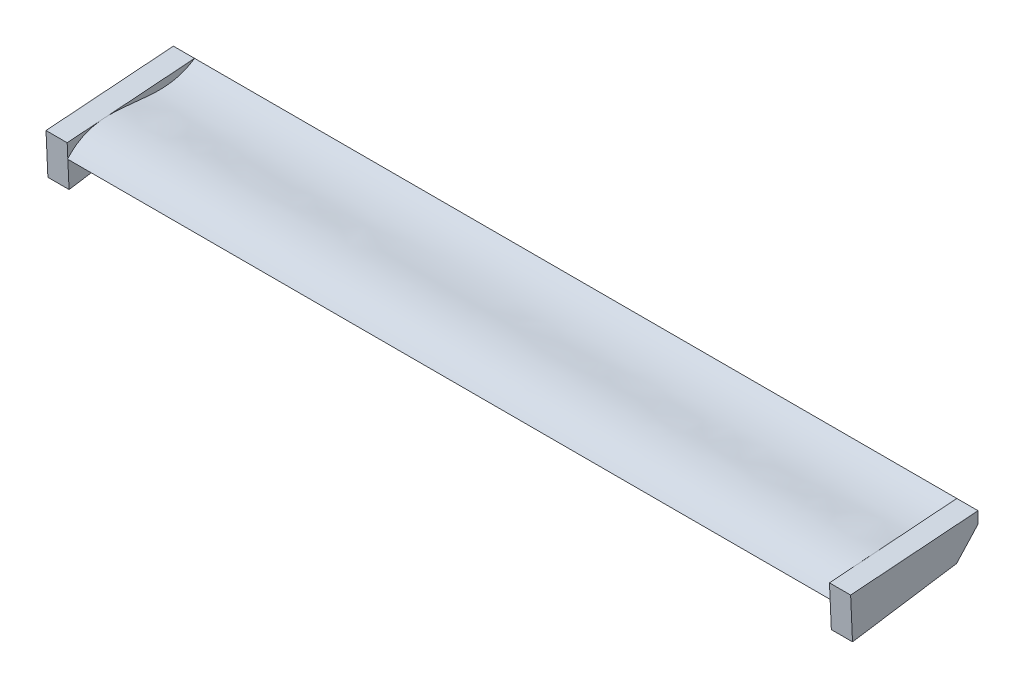
ISO-10303-21;
HEADER;
FILE_DESCRIPTION(('STEP AP214'),'2;1');
FILE_NAME('part.step','',(''),(''),'','','');
FILE_SCHEMA(('AUTOMOTIVE_DESIGN { 1 0 10303 214 1 1 1 1 }'));
ENDSEC;
DATA;
#1=APPLICATION_CONTEXT('core data for automotive mechanical design processes');
#2=APPLICATION_PROTOCOL_DEFINITION('international standard','automotive_design',2000,#1);
#3=PRODUCT_CONTEXT('',#1,'mechanical');
#4=PRODUCT('Part','Part','',(#3));
#5=PRODUCT_RELATED_PRODUCT_CATEGORY('part','',(#4));
#6=PRODUCT_DEFINITION_FORMATION('','',#4);
#7=PRODUCT_DEFINITION_CONTEXT('part definition',#1,'design');
#8=PRODUCT_DEFINITION('design','',#6,#7);
#9=PRODUCT_DEFINITION_SHAPE('','',#8);
#10=(LENGTH_UNIT() NAMED_UNIT(*) SI_UNIT(.MILLI.,.METRE.));
#11=(NAMED_UNIT(*) PLANE_ANGLE_UNIT() SI_UNIT($,.RADIAN.));
#12=(NAMED_UNIT(*) SI_UNIT($,.STERADIAN.) SOLID_ANGLE_UNIT());
#13=UNCERTAINTY_MEASURE_WITH_UNIT(LENGTH_MEASURE(1.E-05),#10,'distance_accuracy_value','');
#14=(GEOMETRIC_REPRESENTATION_CONTEXT(3) GLOBAL_UNCERTAINTY_ASSIGNED_CONTEXT((#13)) GLOBAL_UNIT_ASSIGNED_CONTEXT((#10,
#11,#12)) REPRESENTATION_CONTEXT('',''));
#15=CARTESIAN_POINT('',(0.,0.,0.));
#16=DIRECTION('',(0.,0.,1.));
#17=DIRECTION('',(1.,0.,0.));
#18=AXIS2_PLACEMENT_3D('',#15,#16,#17);
#19=CARTESIAN_POINT('',(-228.6,9.69499890534352,-8.65269984291281));
#20=DIRECTION('',(1.,0.,0.));
#21=DIRECTION('',(0.,0.,-1.));
#22=AXIS2_PLACEMENT_3D('',#19,#20,#21);
#23=PLANE('',#22);
#24=DIRECTION('',(0.,0.0735800875918364,-0.997289311438751));
#25=VECTOR('',#24,1.);
#26=CARTESIAN_POINT('',(-228.6,14.2300293944738,-47.8646443268665));
#27=LINE('',#26,#25);
#28=CARTESIAN_POINT('',(-228.6,10.0080194120768,9.35960704381875));
#29=VERTEX_POINT('',#28);
#30=CARTESIAN_POINT('',(-228.6,10.4236993447086,3.72556708326714));
#31=VERTEX_POINT('',#30);
#32=EDGE_CURVE('E11',#29,#31,#27,.T.);
#33=ORIENTED_EDGE('',*,*,#32,.F.);
#34=CARTESIAN_POINT('',(-228.6,14.2300293944738,-47.8646443268665));
#35=CARTESIAN_POINT('',(-228.6,-2.21974241017821,-23.9521265541001));
#36=CARTESIAN_POINT('',(-228.6,23.3297296929363,7.38802319091033));
#37=CARTESIAN_POINT('',(-228.6,0.,28.3353556731335));
#38=B_SPLINE_CURVE_WITH_KNOTS('',3,(#34,#35,#36,#37),.UNSPECIFIED.,.F.,.F.,(4,4),(0.,1.),.UNSPECIFIED.);
#39=EDGE_CURVE('E489',#31,#29,#38,.T.);
#40=ORIENTED_EDGE('',*,*,#39,.F.);
#41=EDGE_LOOP('',(#33,#40));
#42=FACE_BOUND('',#41,.T.);
#43=ADVANCED_FACE('F41',(#42),#23,.F.);
#44=DIRECTION('',(0.,0.998968540210299,0.0454076609186501));
#45=VECTOR('',#44,1.);
#46=CARTESIAN_POINT('',(-228.6,8.59358614933567,28.530543377845));
#47=LINE('',#46,#45);
#48=CARTESIAN_POINT('',(-228.6,-0.111522128708272,28.1348566379332));
#49=VERTEX_POINT('',#48);
#50=CARTESIAN_POINT('',(-228.6,0.205662422593726,28.1492741175385));
#51=VERTEX_POINT('',#50);
#52=EDGE_CURVE('E51',#49,#51,#47,.T.);
#53=ORIENTED_EDGE('',*,*,#52,.F.);
#54=CARTESIAN_POINT('',(-228.6,0.,28.3353556731335));
#55=CARTESIAN_POINT('',(-228.6,-13.4828406010972,4.22034824974347));
#56=CARTESIAN_POINT('',(-228.6,-7.40950498381303,-29.9192030629698));
#57=CARTESIAN_POINT('',(-228.6,14.2300293944738,-47.8646443268665));
#58=B_SPLINE_CURVE_WITH_KNOTS('',3,(#54,#55,#56,#57),.UNSPECIFIED.,.F.,.F.,(4,4),(0.,1.),.UNSPECIFIED.);
#59=CARTESIAN_POINT('',(-228.6,0.,28.3353556731335));
#60=VERTEX_POINT('',#59);
#61=EDGE_CURVE('E473',#60,#49,#58,.T.);
#62=ORIENTED_EDGE('',*,*,#61,.F.);
#63=EDGE_CURVE('E225',#51,#60,#38,.T.);
#64=ORIENTED_EDGE('',*,*,#63,.F.);
#65=EDGE_LOOP('',(#53,#62,#64));
#66=FACE_BOUND('',#65,.T.);
#67=ADVANCED_FACE('F259',(#66),#23,.F.);
#68=CARTESIAN_POINT('',(228.6,9.69499890534352,-8.65269984291281));
#69=DIRECTION('',(1.,0.,0.));
#70=DIRECTION('',(0.,0.,-1.));
#71=AXIS2_PLACEMENT_3D('',#68,#69,#70);
#72=PLANE('',#71);
#73=DIRECTION('',(0.,-0.998968540210299,-0.0454076609186501));
#74=VECTOR('',#73,1.);
#75=CARTESIAN_POINT('',(228.6,8.59358614933567,28.530543377845));
#76=LINE('',#75,#74);
#77=CARTESIAN_POINT('',(228.6,0.205662422593747,28.1492741175379));
#78=VERTEX_POINT('',#77);
#79=CARTESIAN_POINT('',(228.6,-0.111522128708272,28.1348566379332));
#80=VERTEX_POINT('',#79);
#81=EDGE_CURVE('E209',#78,#80,#76,.T.);
#82=ORIENTED_EDGE('',*,*,#81,.F.);
#83=CARTESIAN_POINT('',(228.6,14.2300293944738,-47.8646443268665));
#84=CARTESIAN_POINT('',(228.6,-2.21974241017821,-23.9521265541001));
#85=CARTESIAN_POINT('',(228.6,23.3297296929363,7.38802319091033));
#86=CARTESIAN_POINT('',(228.6,0.,28.3353556731335));
#87=B_SPLINE_CURVE_WITH_KNOTS('',3,(#83,#84,#85,#86),.UNSPECIFIED.,.F.,.F.,(4,4),(0.,1.),.UNSPECIFIED.);
#88=CARTESIAN_POINT('',(228.6,0.,28.3353556731335));
#89=VERTEX_POINT('',#88);
#90=EDGE_CURVE('E234',#78,#89,#87,.T.);
#91=ORIENTED_EDGE('',*,*,#90,.T.);
#92=CARTESIAN_POINT('',(228.6,0.,28.3353556731335));
#93=CARTESIAN_POINT('',(228.6,-13.4828406010972,4.22034824974347));
#94=CARTESIAN_POINT('',(228.6,-7.40950498381303,-29.9192030629698));
#95=CARTESIAN_POINT('',(228.6,14.2300293944738,-47.8646443268665));
#96=B_SPLINE_CURVE_WITH_KNOTS('',3,(#92,#93,#94,#95),.UNSPECIFIED.,.F.,.F.,(4,4),(0.,1.),.UNSPECIFIED.);
#97=EDGE_CURVE('E235',#89,#80,#96,.T.);
#98=ORIENTED_EDGE('',*,*,#97,.T.);
#99=EDGE_LOOP('',(#82,#91,#98));
#100=FACE_BOUND('',#99,.T.);
#101=ADVANCED_FACE('F264',(#100),#72,.T.);
#102=DIRECTION('',(-1.,0.,0.));
#103=VECTOR('',#102,1.);
#104=SURFACE_OF_LINEAR_EXTRUSION('',#87,#103);
#105=CARTESIAN_POINT('',(-228.6,14.2300293944738,-47.8646443268665));
#106=VERTEX_POINT('',#105);
#107=EDGE_CURVE('E245',#106,#31,#38,.T.);
#108=ORIENTED_EDGE('',*,*,#107,.T.);
#109=ORIENTED_EDGE('',*,*,#39,.T.);
#110=EDGE_CURVE('E490',#29,#51,#38,.T.);
#111=ORIENTED_EDGE('',*,*,#110,.T.);
#112=ORIENTED_EDGE('',*,*,#63,.T.);
#113=DIRECTION('',(-1.,0.,0.));
#114=VECTOR('',#113,1.);
#115=CARTESIAN_POINT('',(228.6,0.,28.3353556731335));
#116=LINE('',#115,#114);
#117=EDGE_CURVE('E46',#89,#60,#116,.T.);
#118=ORIENTED_EDGE('',*,*,#117,.F.);
#119=ORIENTED_EDGE('',*,*,#90,.F.);
#120=CARTESIAN_POINT('',(228.6,10.0080194120768,9.35960704381872));
#121=VERTEX_POINT('',#120);
#122=EDGE_CURVE('E470',#121,#78,#87,.T.);
#123=ORIENTED_EDGE('',*,*,#122,.F.);
#124=CARTESIAN_POINT('',(228.6,10.4236993447086,3.72556708326714));
#125=VERTEX_POINT('',#124);
#126=EDGE_CURVE('E233',#125,#121,#87,.T.);
#127=ORIENTED_EDGE('',*,*,#126,.F.);
#128=CARTESIAN_POINT('',(228.6,14.2300293944738,-47.8646443268665));
#129=VERTEX_POINT('',#128);
#130=EDGE_CURVE('E226',#129,#125,#87,.T.);
#131=ORIENTED_EDGE('',*,*,#130,.F.);
#132=DIRECTION('',(-1.,0.,0.));
#133=VECTOR('',#132,1.);
#134=CARTESIAN_POINT('',(228.6,14.2300293944738,-47.8646443268665));
#135=LINE('',#134,#133);
#136=EDGE_CURVE('E244',#129,#106,#135,.T.);
#137=ORIENTED_EDGE('',*,*,#136,.T.);
#138=EDGE_LOOP('',(#108,#109,#111,#112,#118,#119,#123,#127,#131,#137));
#139=FACE_BOUND('',#138,.T.);
#140=ADVANCED_FACE('F43',(#139),#104,.F.);
#141=DIRECTION('',(-1.,0.,0.));
#142=VECTOR('',#141,1.);
#143=SURFACE_OF_LINEAR_EXTRUSION('',#96,#142);
#144=ORIENTED_EDGE('',*,*,#61,.T.);
#145=EDGE_CURVE('E484',#49,#106,#58,.T.);
#146=ORIENTED_EDGE('',*,*,#145,.T.);
#147=ORIENTED_EDGE('',*,*,#136,.F.);
#148=EDGE_CURVE('E232',#80,#129,#96,.T.);
#149=ORIENTED_EDGE('',*,*,#148,.F.);
#150=ORIENTED_EDGE('',*,*,#97,.F.);
#151=ORIENTED_EDGE('',*,*,#117,.T.);
#152=EDGE_LOOP('',(#144,#146,#147,#149,#150,#151));
#153=FACE_BOUND('',#152,.T.);
#154=ADVANCED_FACE('F252',(#153),#143,.F.);
#155=DIRECTION('',(0.,-0.0735800875918364,0.997289311438751));
#156=VECTOR('',#155,1.);
#157=CARTESIAN_POINT('',(228.6,14.2300293944738,-47.8646443268665));
#158=LINE('',#157,#156);
#159=EDGE_CURVE('E204',#125,#121,#158,.T.);
#160=ORIENTED_EDGE('',*,*,#159,.F.);
#161=ORIENTED_EDGE('',*,*,#126,.T.);
#162=EDGE_LOOP('',(#160,#161));
#163=FACE_BOUND('',#162,.T.);
#164=ADVANCED_FACE('F255',(#163),#72,.T.);
#165=CARTESIAN_POINT('',(228.6,0.,0.));
#166=DIRECTION('',(1.,0.,0.));
#167=DIRECTION('',(0.,0.,-1.));
#168=AXIS2_PLACEMENT_3D('',#165,#166,#167);
#169=PLANE('',#168);
#170=CARTESIAN_POINT('',(228.6,8.59358614933567,28.530543377845));
#171=VERTEX_POINT('',#170);
#172=EDGE_CURVE('E181',#121,#171,#158,.T.);
#173=ORIENTED_EDGE('',*,*,#172,.F.);
#174=ORIENTED_EDGE('',*,*,#122,.T.);
#175=EDGE_CURVE('E205',#171,#78,#76,.T.);
#176=ORIENTED_EDGE('',*,*,#175,.F.);
#177=EDGE_LOOP('',(#173,#174,#176));
#178=FACE_BOUND('',#177,.T.);
#179=ADVANCED_FACE('F262',(#178),#169,.F.);
#180=EDGE_CURVE('E200',#129,#125,#158,.T.);
#181=ORIENTED_EDGE('',*,*,#180,.F.);
#182=ORIENTED_EDGE('',*,*,#130,.T.);
#183=EDGE_LOOP('',(#181,#182));
#184=FACE_BOUND('',#183,.T.);
#185=ADVANCED_FACE('F289',(#184),#169,.F.);
#186=CARTESIAN_POINT('',(228.6,-16.2982858587268,27.3990946502058));
#187=VERTEX_POINT('',#186);
#188=EDGE_CURVE('E203',#80,#187,#76,.T.);
#189=ORIENTED_EDGE('',*,*,#188,.F.);
#190=ORIENTED_EDGE('',*,*,#148,.T.);
#191=DIRECTION('',(0.,1.,0.));
#192=VECTOR('',#191,1.);
#193=CARTESIAN_POINT('',(228.6,7.20103386916434,-47.8646443268665));
#194=LINE('',#193,#192);
#195=CARTESIAN_POINT('',(228.6,7.20103386916434,-47.8646443268665));
#196=VERTEX_POINT('',#195);
#197=EDGE_CURVE('E178',#196,#129,#194,.T.);
#198=ORIENTED_EDGE('',*,*,#197,.F.);
#199=DIRECTION('',(0.,0.736757347313272,-0.676157238502932));
#200=VECTOR('',#199,1.);
#201=CARTESIAN_POINT('',(228.6,-6.81152345005965,-35.0046544049719));
#202=LINE('',#201,#200);
#203=CARTESIAN_POINT('',(228.6,-6.81152345005965,-35.0046544049719));
#204=VERTEX_POINT('',#203);
#205=EDGE_CURVE('E191',#204,#196,#202,.T.);
#206=ORIENTED_EDGE('',*,*,#205,.F.);
#207=DIRECTION('',(0.,0.150295511585368,-0.98864111749274));
#208=VECTOR('',#207,1.);
#209=CARTESIAN_POINT('',(228.6,-16.2982858587268,27.3990946502058));
#210=LINE('',#209,#208);
#211=EDGE_CURVE('E208',#187,#204,#210,.T.);
#212=ORIENTED_EDGE('',*,*,#211,.F.);
#213=EDGE_LOOP('',(#189,#190,#198,#206,#212));
#214=FACE_BOUND('',#213,.T.);
#215=ADVANCED_FACE('F269',(#214),#169,.F.);
#216=CARTESIAN_POINT('',(241.3,7.20103386916434,-47.8646443268665));
#217=DIRECTION('',(0.,0.,1.));
#218=DIRECTION('',(1.,0.,0.));
#219=AXIS2_PLACEMENT_3D('',#216,#217,#218);
#220=PLANE('',#219);
#221=ORIENTED_EDGE('',*,*,#197,.T.);
#222=DIRECTION('',(-1.,0.,0.));
#223=VECTOR('',#222,1.);
#224=CARTESIAN_POINT('',(241.3,14.2300293944738,-47.8646443268665));
#225=LINE('',#224,#223);
#226=CARTESIAN_POINT('',(241.3,14.2300293944738,-47.8646443268665));
#227=VERTEX_POINT('',#226);
#228=EDGE_CURVE('E223',#227,#129,#225,.T.);
#229=ORIENTED_EDGE('',*,*,#228,.F.);
#230=DIRECTION('',(0.,1.,0.));
#231=VECTOR('',#230,1.);
#232=CARTESIAN_POINT('',(241.3,7.20103386916434,-47.8646443268665));
#233=LINE('',#232,#231);
#234=CARTESIAN_POINT('',(241.3,7.20103386916434,-47.8646443268665));
#235=VERTEX_POINT('',#234);
#236=EDGE_CURVE('E187',#235,#227,#233,.T.);
#237=ORIENTED_EDGE('',*,*,#236,.F.);
#238=DIRECTION('',(-1.,0.,0.));
#239=VECTOR('',#238,1.);
#240=CARTESIAN_POINT('',(241.3,7.20103386916434,-47.8646443268665));
#241=LINE('',#240,#239);
#242=EDGE_CURVE('E198',#235,#196,#241,.T.);
#243=ORIENTED_EDGE('',*,*,#242,.T.);
#244=EDGE_LOOP('',(#221,#229,#237,#243));
#245=FACE_BOUND('',#244,.T.);
#246=ADVANCED_FACE('F265',(#245),#220,.F.);
#247=CARTESIAN_POINT('',(241.3,14.2300293944738,-47.8646443268665));
#248=DIRECTION('',(0.,-0.997289311438751,-0.0735800875918364));
#249=DIRECTION('',(0.,0.0735800875918364,-0.997289311438751));
#250=AXIS2_PLACEMENT_3D('',#247,#248,#249);
#251=PLANE('',#250);
#252=ORIENTED_EDGE('',*,*,#180,.T.);
#253=ORIENTED_EDGE('',*,*,#159,.T.);
#254=ORIENTED_EDGE('',*,*,#172,.T.);
#255=DIRECTION('',(-1.,0.,0.));
#256=VECTOR('',#255,1.);
#257=CARTESIAN_POINT('',(241.3,8.59358614933567,28.530543377845));
#258=LINE('',#257,#256);
#259=CARTESIAN_POINT('',(241.3,8.59358614933567,28.530543377845));
#260=VERTEX_POINT('',#259);
#261=EDGE_CURVE('E220',#260,#171,#258,.T.);
#262=ORIENTED_EDGE('',*,*,#261,.F.);
#263=DIRECTION('',(0.,-0.0735800875918364,0.997289311438751));
#264=VECTOR('',#263,1.);
#265=CARTESIAN_POINT('',(241.3,14.2300293944738,-47.8646443268665));
#266=LINE('',#265,#264);
#267=EDGE_CURVE('E190',#227,#260,#266,.T.);
#268=ORIENTED_EDGE('',*,*,#267,.F.);
#269=ORIENTED_EDGE('',*,*,#228,.T.);
#270=EDGE_LOOP('',(#252,#253,#254,#262,#268,#269));
#271=FACE_BOUND('',#270,.T.);
#272=ADVANCED_FACE('F268',(#271),#251,.F.);
#273=CARTESIAN_POINT('',(241.3,8.59358614933567,28.530543377845));
#274=DIRECTION('',(0.,0.0454076609186501,-0.9989685402103));
#275=DIRECTION('',(0.,0.9989685402103,0.0454076609186501));
#276=AXIS2_PLACEMENT_3D('',#273,#274,#275);
#277=PLANE('',#276);
#278=ORIENTED_EDGE('',*,*,#175,.T.);
#279=ORIENTED_EDGE('',*,*,#81,.T.);
#280=ORIENTED_EDGE('',*,*,#188,.T.);
#281=DIRECTION('',(-1.,0.,0.));
#282=VECTOR('',#281,1.);
#283=CARTESIAN_POINT('',(241.3,-16.2982858587268,27.3990946502058));
#284=LINE('',#283,#282);
#285=CARTESIAN_POINT('',(241.3,-16.2982858587268,27.3990946502058));
#286=VERTEX_POINT('',#285);
#287=EDGE_CURVE('E217',#286,#187,#284,.T.);
#288=ORIENTED_EDGE('',*,*,#287,.F.);
#289=DIRECTION('',(0.,-0.998968540210299,-0.0454076609186501));
#290=VECTOR('',#289,1.);
#291=CARTESIAN_POINT('',(241.3,8.59358614933567,28.530543377845));
#292=LINE('',#291,#290);
#293=EDGE_CURVE('E193',#260,#286,#292,.T.);
#294=ORIENTED_EDGE('',*,*,#293,.F.);
#295=ORIENTED_EDGE('',*,*,#261,.T.);
#296=EDGE_LOOP('',(#278,#279,#280,#288,#294,#295));
#297=FACE_BOUND('',#296,.T.);
#298=ADVANCED_FACE('F273',(#297),#277,.F.);
#299=CARTESIAN_POINT('',(241.3,-16.2982858587268,27.3990946502058));
#300=DIRECTION('',(0.,0.988641117492739,0.150295511585368));
#301=DIRECTION('',(0.,-0.150295511585368,0.98864111749274));
#302=AXIS2_PLACEMENT_3D('',#299,#300,#301);
#303=PLANE('',#302);
#304=ORIENTED_EDGE('',*,*,#211,.T.);
#305=DIRECTION('',(-1.,0.,0.));
#306=VECTOR('',#305,1.);
#307=CARTESIAN_POINT('',(241.3,-6.81152345005965,-35.0046544049719));
#308=LINE('',#307,#306);
#309=CARTESIAN_POINT('',(241.3,-6.81152345005965,-35.0046544049719));
#310=VERTEX_POINT('',#309);
#311=EDGE_CURVE('E214',#310,#204,#308,.T.);
#312=ORIENTED_EDGE('',*,*,#311,.F.);
#313=DIRECTION('',(0.,0.150295511585368,-0.98864111749274));
#314=VECTOR('',#313,1.);
#315=CARTESIAN_POINT('',(241.3,-16.2982858587268,27.3990946502058));
#316=LINE('',#315,#314);
#317=EDGE_CURVE('E195',#286,#310,#316,.T.);
#318=ORIENTED_EDGE('',*,*,#317,.F.);
#319=ORIENTED_EDGE('',*,*,#287,.T.);
#320=EDGE_LOOP('',(#304,#312,#318,#319));
#321=FACE_BOUND('',#320,.T.);
#322=ADVANCED_FACE('F277',(#321),#303,.F.);
#323=CARTESIAN_POINT('',(241.3,-6.81152345005965,-35.0046544049719));
#324=DIRECTION('',(0.,0.676157238502932,0.736757347313272));
#325=DIRECTION('',(0.,-0.736757347313272,0.676157238502932));
#326=AXIS2_PLACEMENT_3D('',#323,#324,#325);
#327=PLANE('',#326);
#328=ORIENTED_EDGE('',*,*,#205,.T.);
#329=ORIENTED_EDGE('',*,*,#242,.F.);
#330=DIRECTION('',(0.,0.736757347313272,-0.676157238502932));
#331=VECTOR('',#330,1.);
#332=CARTESIAN_POINT('',(241.3,-6.81152345005965,-35.0046544049719));
#333=LINE('',#332,#331);
#334=EDGE_CURVE('E197',#310,#235,#333,.T.);
#335=ORIENTED_EDGE('',*,*,#334,.F.);
#336=ORIENTED_EDGE('',*,*,#311,.T.);
#337=EDGE_LOOP('',(#328,#329,#335,#336));
#338=FACE_BOUND('',#337,.T.);
#339=ADVANCED_FACE('F281',(#338),#327,.F.);
#340=CARTESIAN_POINT('',(241.3,0.,0.));
#341=DIRECTION('',(1.,0.,0.));
#342=DIRECTION('',(0.,0.,-1.));
#343=AXIS2_PLACEMENT_3D('',#340,#341,#342);
#344=PLANE('',#343);
#345=ORIENTED_EDGE('',*,*,#236,.T.);
#346=ORIENTED_EDGE('',*,*,#267,.T.);
#347=ORIENTED_EDGE('',*,*,#293,.T.);
#348=ORIENTED_EDGE('',*,*,#317,.T.);
#349=ORIENTED_EDGE('',*,*,#334,.T.);
#350=EDGE_LOOP('',(#345,#346,#347,#348,#349));
#351=FACE_BOUND('',#350,.T.);
#352=ADVANCED_FACE('F285',(#351),#344,.T.);
#353=CARTESIAN_POINT('',(-228.6,0.,0.));
#354=DIRECTION('',(1.,0.,0.));
#355=DIRECTION('',(0.,0.,-1.));
#356=AXIS2_PLACEMENT_3D('',#353,#354,#355);
#357=PLANE('',#356);
#358=ORIENTED_EDGE('',*,*,#110,.F.);
#359=CARTESIAN_POINT('',(-228.6,8.59358614933567,28.530543377845));
#360=VERTEX_POINT('',#359);
#361=EDGE_CURVE('E53',#360,#29,#27,.T.);
#362=ORIENTED_EDGE('',*,*,#361,.F.);
#363=EDGE_CURVE('E494',#51,#360,#47,.T.);
#364=ORIENTED_EDGE('',*,*,#363,.F.);
#365=EDGE_LOOP('',(#358,#362,#364));
#366=FACE_BOUND('',#365,.T.);
#367=ADVANCED_FACE('F293',(#366),#357,.T.);
#368=ORIENTED_EDGE('',*,*,#107,.F.);
#369=EDGE_CURVE('E54',#31,#106,#27,.T.);
#370=ORIENTED_EDGE('',*,*,#369,.F.);
#371=EDGE_LOOP('',(#368,#370));
#372=FACE_BOUND('',#371,.T.);
#373=ADVANCED_FACE('F314',(#372),#357,.T.);
#374=ORIENTED_EDGE('',*,*,#145,.F.);
#375=CARTESIAN_POINT('',(-228.6,-16.2982858587268,27.3990946502058));
#376=VERTEX_POINT('',#375);
#377=EDGE_CURVE('E171',#376,#49,#47,.T.);
#378=ORIENTED_EDGE('',*,*,#377,.F.);
#379=DIRECTION('',(0.,-0.150295511585368,0.98864111749274));
#380=VECTOR('',#379,1.);
#381=CARTESIAN_POINT('',(-228.6,-16.2982858587268,27.3990946502058));
#382=LINE('',#381,#380);
#383=CARTESIAN_POINT('',(-228.6,-6.81152345005965,-35.0046544049719));
#384=VERTEX_POINT('',#383);
#385=EDGE_CURVE('E495',#384,#376,#382,.T.);
#386=ORIENTED_EDGE('',*,*,#385,.F.);
#387=DIRECTION('',(0.,-0.736757347313272,0.676157238502932));
#388=VECTOR('',#387,1.);
#389=CARTESIAN_POINT('',(-228.6,-6.81152345005965,-35.0046544049719));
#390=LINE('',#389,#388);
#391=CARTESIAN_POINT('',(-228.6,7.20103386916434,-47.8646443268665));
#392=VERTEX_POINT('',#391);
#393=EDGE_CURVE('E513',#392,#384,#390,.T.);
#394=ORIENTED_EDGE('',*,*,#393,.F.);
#395=DIRECTION('',(0.,-1.,0.));
#396=VECTOR('',#395,1.);
#397=CARTESIAN_POINT('',(-228.6,7.20103386916434,-47.8646443268665));
#398=LINE('',#397,#396);
#399=EDGE_CURVE('E514',#106,#392,#398,.T.);
#400=ORIENTED_EDGE('',*,*,#399,.F.);
#401=EDGE_LOOP('',(#374,#378,#386,#394,#400));
#402=FACE_BOUND('',#401,.T.);
#403=ADVANCED_FACE('F297',(#402),#357,.T.);
#404=CARTESIAN_POINT('',(-241.3,14.2300293944738,-47.8646443268665));
#405=DIRECTION('',(0.,-0.997289311438751,-0.0735800875918364));
#406=DIRECTION('',(0.,0.0735800875918364,-0.997289311438751));
#407=AXIS2_PLACEMENT_3D('',#404,#405,#406);
#408=PLANE('',#407);
#409=ORIENTED_EDGE('',*,*,#361,.T.);
#410=ORIENTED_EDGE('',*,*,#32,.T.);
#411=ORIENTED_EDGE('',*,*,#369,.T.);
#412=DIRECTION('',(1.,0.,0.));
#413=VECTOR('',#412,1.);
#414=CARTESIAN_POINT('',(-241.3,14.2300293944738,-47.8646443268665));
#415=LINE('',#414,#413);
#416=CARTESIAN_POINT('',(-241.3,14.2300293944738,-47.8646443268665));
#417=VERTEX_POINT('',#416);
#418=EDGE_CURVE('E156',#417,#106,#415,.T.);
#419=ORIENTED_EDGE('',*,*,#418,.F.);
#420=DIRECTION('',(0.,0.0735800875918364,-0.997289311438751));
#421=VECTOR('',#420,1.);
#422=CARTESIAN_POINT('',(-241.3,14.2300293944738,-47.8646443268665));
#423=LINE('',#422,#421);
#424=CARTESIAN_POINT('',(-241.3,8.59358614933567,28.530543377845));
#425=VERTEX_POINT('',#424);
#426=EDGE_CURVE('E162',#425,#417,#423,.T.);
#427=ORIENTED_EDGE('',*,*,#426,.F.);
#428=DIRECTION('',(1.,0.,0.));
#429=VECTOR('',#428,1.);
#430=CARTESIAN_POINT('',(-241.3,8.59358614933567,28.530543377845));
#431=LINE('',#430,#429);
#432=EDGE_CURVE('E503',#425,#360,#431,.T.);
#433=ORIENTED_EDGE('',*,*,#432,.T.);
#434=EDGE_LOOP('',(#409,#410,#411,#419,#427,#433));
#435=FACE_BOUND('',#434,.T.);
#436=ADVANCED_FACE('F175',(#435),#408,.F.);
#437=CARTESIAN_POINT('',(-241.3,7.20103386916434,-47.8646443268665));
#438=DIRECTION('',(0.,0.,1.));
#439=DIRECTION('',(1.,0.,0.));
#440=AXIS2_PLACEMENT_3D('',#437,#438,#439);
#441=PLANE('',#440);
#442=ORIENTED_EDGE('',*,*,#399,.T.);
#443=DIRECTION('',(1.,0.,0.));
#444=VECTOR('',#443,1.);
#445=CARTESIAN_POINT('',(-241.3,7.20103386916434,-47.8646443268665));
#446=LINE('',#445,#444);
#447=CARTESIAN_POINT('',(-241.3,7.20103386916434,-47.8646443268665));
#448=VERTEX_POINT('',#447);
#449=EDGE_CURVE('E158',#448,#392,#446,.T.);
#450=ORIENTED_EDGE('',*,*,#449,.F.);
#451=DIRECTION('',(0.,-1.,0.));
#452=VECTOR('',#451,1.);
#453=CARTESIAN_POINT('',(-241.3,7.20103386916434,-47.8646443268665));
#454=LINE('',#453,#452);
#455=EDGE_CURVE('E152',#417,#448,#454,.T.);
#456=ORIENTED_EDGE('',*,*,#455,.F.);
#457=ORIENTED_EDGE('',*,*,#418,.T.);
#458=EDGE_LOOP('',(#442,#450,#456,#457));
#459=FACE_BOUND('',#458,.T.);
#460=ADVANCED_FACE('F154',(#459),#441,.F.);
#461=CARTESIAN_POINT('',(-241.3,-6.81152345005965,-35.0046544049719));
#462=DIRECTION('',(0.,0.676157238502932,0.736757347313272));
#463=DIRECTION('',(0.,-0.736757347313272,0.676157238502932));
#464=AXIS2_PLACEMENT_3D('',#461,#462,#463);
#465=PLANE('',#464);
#466=ORIENTED_EDGE('',*,*,#393,.T.);
#467=DIRECTION('',(1.,0.,0.));
#468=VECTOR('',#467,1.);
#469=CARTESIAN_POINT('',(-241.3,-6.81152345005965,-35.0046544049719));
#470=LINE('',#469,#468);
#471=CARTESIAN_POINT('',(-241.3,-6.81152345005965,-35.0046544049719));
#472=VERTEX_POINT('',#471);
#473=EDGE_CURVE('E183',#472,#384,#470,.T.);
#474=ORIENTED_EDGE('',*,*,#473,.F.);
#475=DIRECTION('',(0.,-0.736757347313272,0.676157238502932));
#476=VECTOR('',#475,1.);
#477=CARTESIAN_POINT('',(-241.3,-6.81152345005965,-35.0046544049719));
#478=LINE('',#477,#476);
#479=EDGE_CURVE('E161',#448,#472,#478,.T.);
#480=ORIENTED_EDGE('',*,*,#479,.F.);
#481=ORIENTED_EDGE('',*,*,#449,.T.);
#482=EDGE_LOOP('',(#466,#474,#480,#481));
#483=FACE_BOUND('',#482,.T.);
#484=ADVANCED_FACE('F300',(#483),#465,.F.);
#485=CARTESIAN_POINT('',(-241.3,-16.2982858587268,27.3990946502058));
#486=DIRECTION('',(0.,0.988641117492739,0.150295511585368));
#487=DIRECTION('',(0.,-0.150295511585368,0.98864111749274));
#488=AXIS2_PLACEMENT_3D('',#485,#486,#487);
#489=PLANE('',#488);
#490=ORIENTED_EDGE('',*,*,#385,.T.);
#491=DIRECTION('',(1.,0.,0.));
#492=VECTOR('',#491,1.);
#493=CARTESIAN_POINT('',(-241.3,-16.2982858587268,27.3990946502058));
#494=LINE('',#493,#492);
#495=CARTESIAN_POINT('',(-241.3,-16.2982858587268,27.3990946502058));
#496=VERTEX_POINT('',#495);
#497=EDGE_CURVE('E505',#496,#376,#494,.T.);
#498=ORIENTED_EDGE('',*,*,#497,.F.);
#499=DIRECTION('',(0.,-0.150295511585368,0.98864111749274));
#500=VECTOR('',#499,1.);
#501=CARTESIAN_POINT('',(-241.3,-16.2982858587268,27.3990946502058));
#502=LINE('',#501,#500);
#503=EDGE_CURVE('E511',#472,#496,#502,.T.);
#504=ORIENTED_EDGE('',*,*,#503,.F.);
#505=ORIENTED_EDGE('',*,*,#473,.T.);
#506=EDGE_LOOP('',(#490,#498,#504,#505));
#507=FACE_BOUND('',#506,.T.);
#508=ADVANCED_FACE('F303',(#507),#489,.F.);
#509=CARTESIAN_POINT('',(-241.3,8.59358614933567,28.530543377845));
#510=DIRECTION('',(0.,0.0454076609186501,-0.9989685402103));
#511=DIRECTION('',(0.,0.9989685402103,0.0454076609186501));
#512=AXIS2_PLACEMENT_3D('',#509,#510,#511);
#513=PLANE('',#512);
#514=ORIENTED_EDGE('',*,*,#377,.T.);
#515=ORIENTED_EDGE('',*,*,#52,.T.);
#516=ORIENTED_EDGE('',*,*,#363,.T.);
#517=ORIENTED_EDGE('',*,*,#432,.F.);
#518=DIRECTION('',(0.,0.998968540210299,0.0454076609186501));
#519=VECTOR('',#518,1.);
#520=CARTESIAN_POINT('',(-241.3,8.59358614933567,28.530543377845));
#521=LINE('',#520,#519);
#522=EDGE_CURVE('E167',#496,#425,#521,.T.);
#523=ORIENTED_EDGE('',*,*,#522,.F.);
#524=ORIENTED_EDGE('',*,*,#497,.T.);
#525=EDGE_LOOP('',(#514,#515,#516,#517,#523,#524));
#526=FACE_BOUND('',#525,.T.);
#527=ADVANCED_FACE('F307',(#526),#513,.F.);
#528=CARTESIAN_POINT('',(-241.3,0.,0.));
#529=DIRECTION('',(1.,0.,0.));
#530=DIRECTION('',(0.,0.,-1.));
#531=AXIS2_PLACEMENT_3D('',#528,#529,#530);
#532=PLANE('',#531);
#533=ORIENTED_EDGE('',*,*,#426,.T.);
#534=ORIENTED_EDGE('',*,*,#455,.T.);
#535=ORIENTED_EDGE('',*,*,#479,.T.);
#536=ORIENTED_EDGE('',*,*,#503,.T.);
#537=ORIENTED_EDGE('',*,*,#522,.T.);
#538=EDGE_LOOP('',(#533,#534,#535,#536,#537));
#539=FACE_BOUND('',#538,.T.);
#540=ADVANCED_FACE('F165',(#539),#532,.F.);
#541=CLOSED_SHELL('',(#43,#67,#101,#140,#154,#164,#179,#185,#215,#246,#272,#298,#322,#339,#352,
#367,#373,#403,#436,#460,#484,#508,#527,#540));
#542=MANIFOLD_SOLID_BREP('B2',#541);
#543=ADVANCED_BREP_SHAPE_REPRESENTATION('',(#18,#542),#14);
#544=SHAPE_DEFINITION_REPRESENTATION(#9,#543);
ENDSEC;
END-ISO-10303-21;
